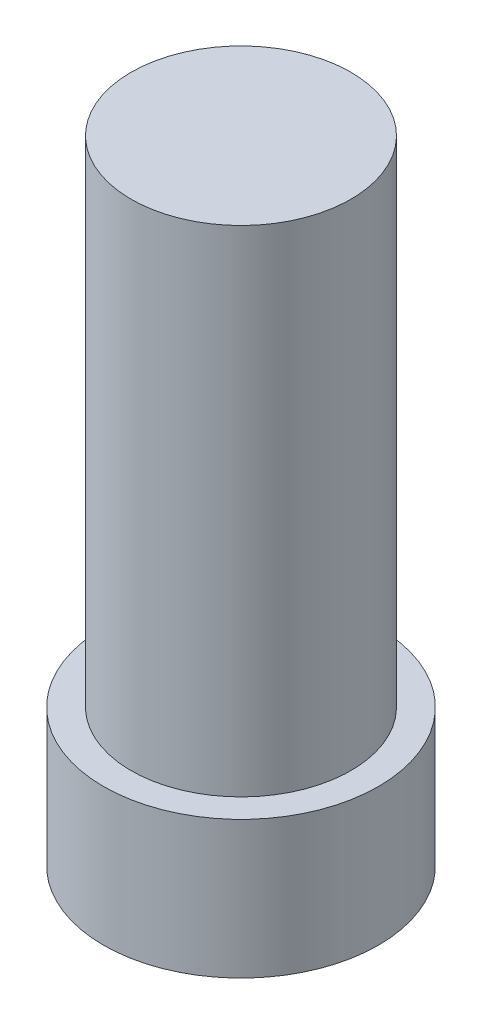
ISO-10303-21;
HEADER;
FILE_DESCRIPTION(('STEP AP214'),'2;1');
FILE_NAME('part.step','',(''),(''),'','','');
FILE_SCHEMA(('AUTOMOTIVE_DESIGN { 1 0 10303 214 1 1 1 1 }'));
ENDSEC;
DATA;
#1=APPLICATION_CONTEXT('core data for automotive mechanical design processes');
#2=APPLICATION_PROTOCOL_DEFINITION('international standard','automotive_design',2000,#1);
#3=PRODUCT_CONTEXT('',#1,'mechanical');
#4=PRODUCT('Part','Part','',(#3));
#5=PRODUCT_RELATED_PRODUCT_CATEGORY('part','',(#4));
#6=PRODUCT_DEFINITION_FORMATION('','',#4);
#7=PRODUCT_DEFINITION_CONTEXT('part definition',#1,'design');
#8=PRODUCT_DEFINITION('design','',#6,#7);
#9=PRODUCT_DEFINITION_SHAPE('','',#8);
#10=(LENGTH_UNIT() NAMED_UNIT(*) SI_UNIT(.MILLI.,.METRE.));
#11=(NAMED_UNIT(*) PLANE_ANGLE_UNIT() SI_UNIT($,.RADIAN.));
#12=(NAMED_UNIT(*) SI_UNIT($,.STERADIAN.) SOLID_ANGLE_UNIT());
#13=UNCERTAINTY_MEASURE_WITH_UNIT(LENGTH_MEASURE(1.E-05),#10,'distance_accuracy_value','');
#14=(GEOMETRIC_REPRESENTATION_CONTEXT(3) GLOBAL_UNCERTAINTY_ASSIGNED_CONTEXT((#13)) GLOBAL_UNIT_ASSIGNED_CONTEXT((#10,
#11,#12)) REPRESENTATION_CONTEXT('',''));
#15=CARTESIAN_POINT('',(0.,0.,0.));
#16=DIRECTION('',(0.,0.,1.));
#17=DIRECTION('',(1.,0.,0.));
#18=AXIS2_PLACEMENT_3D('',#15,#16,#17);
#19=CARTESIAN_POINT('',(0.,0.,0.));
#20=DIRECTION('',(0.,-1.,0.));
#21=DIRECTION('',(1.,0.,0.));
#22=AXIS2_PLACEMENT_3D('',#19,#20,#21);
#23=PLANE('',#22);
#24=CARTESIAN_POINT('',(0.,0.,0.));
#25=DIRECTION('',(0.,1.,0.));
#26=DIRECTION('',(-1.,0.,0.));
#27=AXIS2_PLACEMENT_3D('',#24,#25,#26);
#28=CIRCLE('',#27,4.);
#29=CARTESIAN_POINT('',(-4.,0.,0.));
#30=VERTEX_POINT('',#29);
#31=EDGE_CURVE('E10',#30,#30,#28,.T.);
#32=ORIENTED_EDGE('',*,*,#31,.T.);
#33=EDGE_LOOP('',(#32));
#34=FACE_BOUND('',#33,.T.);
#35=ADVANCED_FACE('F39',(#34),#23,.F.);
#36=CARTESIAN_POINT('',(0.,5.,0.));
#37=DIRECTION('',(0.,1.,0.));
#38=DIRECTION('',(-1.,0.,0.));
#39=AXIS2_PLACEMENT_3D('',#36,#37,#38);
#40=CYLINDRICAL_SURFACE('',#39,4.);
#41=ORIENTED_EDGE('',*,*,#31,.F.);
#42=EDGE_LOOP('',(#41));
#43=FACE_BOUND('',#42,.T.);
#44=CARTESIAN_POINT('',(0.,-18.,0.));
#45=DIRECTION('',(0.,1.,0.));
#46=DIRECTION('',(-1.,0.,0.));
#47=AXIS2_PLACEMENT_3D('',#44,#45,#46);
#48=CIRCLE('',#47,4.);
#49=CARTESIAN_POINT('',(-4.,-18.,0.));
#50=VERTEX_POINT('',#49);
#51=EDGE_CURVE('E45',#50,#50,#48,.T.);
#52=ORIENTED_EDGE('',*,*,#51,.T.);
#53=EDGE_LOOP('',(#52));
#54=FACE_BOUND('',#53,.T.);
#55=ADVANCED_FACE('F71',(#43,#54),#40,.T.);
#56=CARTESIAN_POINT('',(4.,-18.,0.));
#57=DIRECTION('',(0.,-1.,0.));
#58=DIRECTION('',(1.,0.,0.));
#59=AXIS2_PLACEMENT_3D('',#56,#57,#58);
#60=PLANE('',#59);
#61=ORIENTED_EDGE('',*,*,#51,.F.);
#62=EDGE_LOOP('',(#61));
#63=FACE_BOUND('',#62,.T.);
#64=CARTESIAN_POINT('',(0.,-18.,0.));
#65=DIRECTION('',(0.,1.,0.));
#66=DIRECTION('',(-1.,0.,0.));
#67=AXIS2_PLACEMENT_3D('',#64,#65,#66);
#68=CIRCLE('',#67,5.);
#69=CARTESIAN_POINT('',(-5.,-18.,0.));
#70=VERTEX_POINT('',#69);
#71=EDGE_CURVE('E49',#70,#70,#68,.T.);
#72=ORIENTED_EDGE('',*,*,#71,.T.);
#73=EDGE_LOOP('',(#72));
#74=FACE_BOUND('',#73,.T.);
#75=ADVANCED_FACE('F67',(#63,#74),#60,.F.);
#76=CARTESIAN_POINT('',(0.,5.,0.));
#77=DIRECTION('',(0.,1.,0.));
#78=DIRECTION('',(-1.,0.,0.));
#79=AXIS2_PLACEMENT_3D('',#76,#77,#78);
#80=CYLINDRICAL_SURFACE('',#79,5.);
#81=ORIENTED_EDGE('',*,*,#71,.F.);
#82=EDGE_LOOP('',(#81));
#83=FACE_BOUND('',#82,.T.);
#84=CARTESIAN_POINT('',(0.,-23.,0.));
#85=DIRECTION('',(0.,1.,0.));
#86=DIRECTION('',(-1.,0.,0.));
#87=AXIS2_PLACEMENT_3D('',#84,#85,#86);
#88=CIRCLE('',#87,5.);
#89=CARTESIAN_POINT('',(-5.,-23.,0.));
#90=VERTEX_POINT('',#89);
#91=EDGE_CURVE('E53',#90,#90,#88,.T.);
#92=ORIENTED_EDGE('',*,*,#91,.T.);
#93=EDGE_LOOP('',(#92));
#94=FACE_BOUND('',#93,.T.);
#95=ADVANCED_FACE('F59',(#83,#94),#80,.T.);
#96=CARTESIAN_POINT('',(5.00000000000001,-23.,0.));
#97=DIRECTION('',(0.,1.,0.));
#98=DIRECTION('',(-1.,0.,0.));
#99=AXIS2_PLACEMENT_3D('',#96,#97,#98);
#100=PLANE('',#99);
#101=ORIENTED_EDGE('',*,*,#91,.F.);
#102=EDGE_LOOP('',(#101));
#103=FACE_BOUND('',#102,.T.);
#104=ADVANCED_FACE('F61',(#103),#100,.F.);
#105=CLOSED_SHELL('',(#35,#55,#75,#95,#104));
#106=MANIFOLD_SOLID_BREP('B2',#105);
#107=ADVANCED_BREP_SHAPE_REPRESENTATION('',(#18,#106),#14);
#108=SHAPE_DEFINITION_REPRESENTATION(#9,#107);
ENDSEC;
END-ISO-10303-21;
